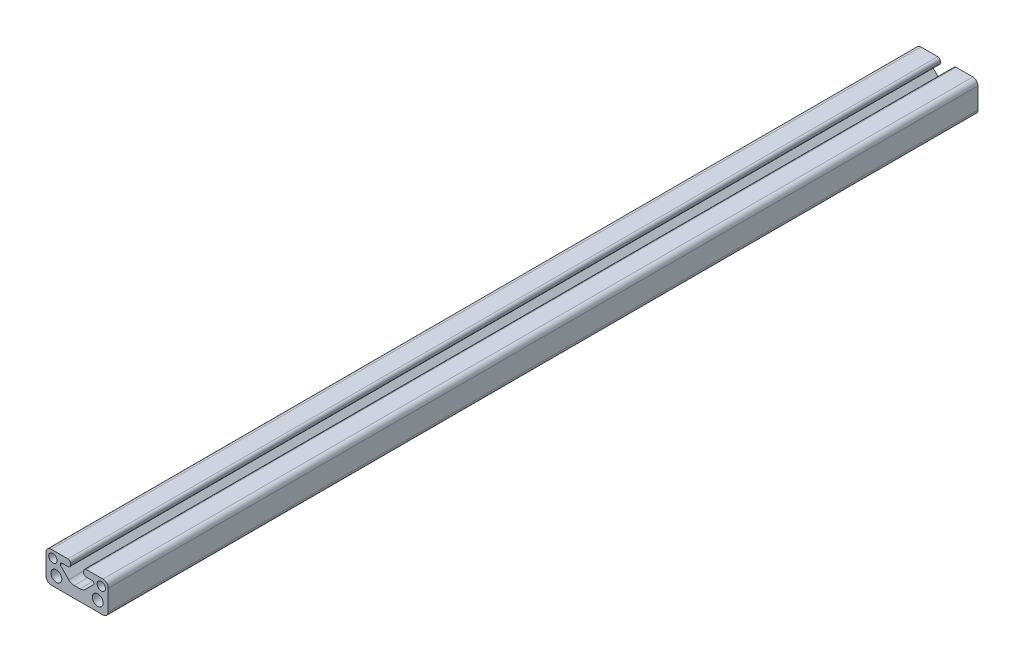
ISO-10303-21;
HEADER;
FILE_DESCRIPTION(('STEP AP214'),'2;1');
FILE_NAME('part.step','',(''),(''),'','','');
FILE_SCHEMA(('AUTOMOTIVE_DESIGN { 1 0 10303 214 1 1 1 1 }'));
ENDSEC;
DATA;
#1=APPLICATION_CONTEXT('core data for automotive mechanical design processes');
#2=APPLICATION_PROTOCOL_DEFINITION('international standard','automotive_design',2000,#1);
#3=PRODUCT_CONTEXT('',#1,'mechanical');
#4=PRODUCT('Part','Part','',(#3));
#5=PRODUCT_RELATED_PRODUCT_CATEGORY('part','',(#4));
#6=PRODUCT_DEFINITION_FORMATION('','',#4);
#7=PRODUCT_DEFINITION_CONTEXT('part definition',#1,'design');
#8=PRODUCT_DEFINITION('design','',#6,#7);
#9=PRODUCT_DEFINITION_SHAPE('','',#8);
#10=(LENGTH_UNIT() NAMED_UNIT(*) SI_UNIT(.MILLI.,.METRE.));
#11=(NAMED_UNIT(*) PLANE_ANGLE_UNIT() SI_UNIT($,.RADIAN.));
#12=(NAMED_UNIT(*) SI_UNIT($,.STERADIAN.) SOLID_ANGLE_UNIT());
#13=UNCERTAINTY_MEASURE_WITH_UNIT(LENGTH_MEASURE(1.E-05),#10,'distance_accuracy_value','');
#14=(GEOMETRIC_REPRESENTATION_CONTEXT(3) GLOBAL_UNCERTAINTY_ASSIGNED_CONTEXT((#13)) GLOBAL_UNIT_ASSIGNED_CONTEXT((#10,
#11,#12)) REPRESENTATION_CONTEXT('',''));
#15=CARTESIAN_POINT('',(0.,0.,0.));
#16=DIRECTION('',(0.,0.,1.));
#17=DIRECTION('',(1.,0.,0.));
#18=AXIS2_PLACEMENT_3D('',#15,#16,#17);
#19=CARTESIAN_POINT('',(-15.8749999999998,3.17500000000252,0.));
#20=DIRECTION('',(0.,0.,-1.));
#21=DIRECTION('',(-1.,0.,0.));
#22=AXIS2_PLACEMENT_3D('',#19,#20,#21);
#23=CYLINDRICAL_SURFACE('',#22,3.17500000000048);
#24=CARTESIAN_POINT('',(-15.8749999999998,3.17500000000252,-533.4));
#25=DIRECTION('',(0.,0.,-1.));
#26=DIRECTION('',(-1.,0.,0.));
#27=AXIS2_PLACEMENT_3D('',#24,#25,#26);
#28=CIRCLE('',#27,3.17500000000048);
#29=CARTESIAN_POINT('',(-15.8749999999998,2.03526431818979E-12,-533.4));
#30=VERTEX_POINT('',#29);
#31=CARTESIAN_POINT('',(-19.0500000000003,3.17500000000252,-533.4));
#32=VERTEX_POINT('',#31);
#33=EDGE_CURVE('E250',#30,#32,#28,.T.);
#34=ORIENTED_EDGE('',*,*,#33,.F.);
#35=DIRECTION('',(0.,0.,-1.));
#36=VECTOR('',#35,1.);
#37=CARTESIAN_POINT('',(-15.8749999999998,2.03526431818979E-12,0.));
#38=LINE('',#37,#36);
#39=CARTESIAN_POINT('',(-15.8749999999998,2.03526431818979E-12,0.));
#40=VERTEX_POINT('',#39);
#41=EDGE_CURVE('E11',#40,#30,#38,.T.);
#42=ORIENTED_EDGE('',*,*,#41,.F.);
#43=CARTESIAN_POINT('',(-15.8749999999998,3.17500000000252,0.));
#44=DIRECTION('',(0.,0.,-1.));
#45=DIRECTION('',(-1.,0.,0.));
#46=AXIS2_PLACEMENT_3D('',#43,#44,#45);
#47=CIRCLE('',#46,3.17500000000048);
#48=CARTESIAN_POINT('',(-19.0500000000003,3.17500000000252,0.));
#49=VERTEX_POINT('',#48);
#50=EDGE_CURVE('E331',#40,#49,#47,.T.);
#51=ORIENTED_EDGE('',*,*,#50,.T.);
#52=DIRECTION('',(0.,0.,-1.));
#53=VECTOR('',#52,1.);
#54=CARTESIAN_POINT('',(-19.0500000000003,3.17500000000252,0.));
#55=LINE('',#54,#53);
#56=EDGE_CURVE('E36',#49,#32,#55,.T.);
#57=ORIENTED_EDGE('',*,*,#56,.T.);
#58=EDGE_LOOP('',(#34,#42,#51,#57));
#59=FACE_BOUND('',#58,.T.);
#60=ADVANCED_FACE('F33',(#59),#23,.T.);
#61=CARTESIAN_POINT('',(15.8749999999993,2.03526431818979E-12,0.));
#62=DIRECTION('',(0.,-1.,0.));
#63=DIRECTION('',(0.,0.,-1.));
#64=AXIS2_PLACEMENT_3D('',#61,#62,#63);
#65=PLANE('',#64);
#66=DIRECTION('',(-1.,0.,0.));
#67=VECTOR('',#66,1.);
#68=CARTESIAN_POINT('',(15.8749999999993,2.03526431818979E-12,-533.4));
#69=LINE('',#68,#67);
#70=CARTESIAN_POINT('',(15.8749999999993,2.03483063732079E-12,-533.4));
#71=VERTEX_POINT('',#70);
#72=EDGE_CURVE('E329',#71,#30,#69,.T.);
#73=ORIENTED_EDGE('',*,*,#72,.F.);
#74=DIRECTION('',(0.,0.,-1.));
#75=VECTOR('',#74,1.);
#76=CARTESIAN_POINT('',(15.8749999999993,2.03483063732079E-12,0.));
#77=LINE('',#76,#75);
#78=CARTESIAN_POINT('',(15.8749999999993,2.03483063732079E-12,0.));
#79=VERTEX_POINT('',#78);
#80=EDGE_CURVE('E42',#79,#71,#77,.T.);
#81=ORIENTED_EDGE('',*,*,#80,.F.);
#82=DIRECTION('',(-1.,0.,0.));
#83=VECTOR('',#82,1.);
#84=CARTESIAN_POINT('',(15.8749999999993,2.03526431818979E-12,0.));
#85=LINE('',#84,#83);
#86=EDGE_CURVE('E240',#79,#40,#85,.T.);
#87=ORIENTED_EDGE('',*,*,#86,.T.);
#88=ORIENTED_EDGE('',*,*,#41,.T.);
#89=EDGE_LOOP('',(#73,#81,#87,#88));
#90=FACE_BOUND('',#89,.T.);
#91=ADVANCED_FACE('F383',(#90),#65,.T.);
#92=CARTESIAN_POINT('',(15.8749999999993,3.17500000000227,0.));
#93=DIRECTION('',(0.,0.,-1.));
#94=DIRECTION('',(-1.,0.,0.));
#95=AXIS2_PLACEMENT_3D('',#92,#93,#94);
#96=CYLINDRICAL_SURFACE('',#95,3.17500000000024);
#97=CARTESIAN_POINT('',(15.8749999999993,3.17500000000227,-533.4));
#98=DIRECTION('',(0.,0.,-1.));
#99=DIRECTION('',(-1.,0.,0.));
#100=AXIS2_PLACEMENT_3D('',#97,#98,#99);
#101=CIRCLE('',#100,3.17500000000024);
#102=CARTESIAN_POINT('',(19.0499999999995,3.17500000000227,-533.4));
#103=VERTEX_POINT('',#102);
#104=EDGE_CURVE('E227',#103,#71,#101,.T.);
#105=ORIENTED_EDGE('',*,*,#104,.F.);
#106=DIRECTION('',(0.,0.,-1.));
#107=VECTOR('',#106,1.);
#108=CARTESIAN_POINT('',(19.0499999999995,3.17500000000227,0.));
#109=LINE('',#108,#107);
#110=CARTESIAN_POINT('',(19.0499999999995,3.17500000000227,0.));
#111=VERTEX_POINT('',#110);
#112=EDGE_CURVE('E222',#111,#103,#109,.T.);
#113=ORIENTED_EDGE('',*,*,#112,.F.);
#114=CARTESIAN_POINT('',(15.8749999999993,3.17500000000227,0.));
#115=DIRECTION('',(0.,0.,-1.));
#116=DIRECTION('',(-1.,0.,0.));
#117=AXIS2_PLACEMENT_3D('',#114,#115,#116);
#118=CIRCLE('',#117,3.17500000000024);
#119=EDGE_CURVE('E225',#111,#79,#118,.T.);
#120=ORIENTED_EDGE('',*,*,#119,.T.);
#121=ORIENTED_EDGE('',*,*,#80,.T.);
#122=EDGE_LOOP('',(#105,#113,#120,#121));
#123=FACE_BOUND('',#122,.T.);
#124=ADVANCED_FACE('F224',(#123),#96,.T.);
#125=CARTESIAN_POINT('',(19.0499999999995,15.8750000000008,0.));
#126=DIRECTION('',(1.,0.,0.));
#127=DIRECTION('',(0.,1.,0.));
#128=AXIS2_PLACEMENT_3D('',#125,#126,#127);
#129=PLANE('',#128);
#130=DIRECTION('',(0.,-1.,0.));
#131=VECTOR('',#130,1.);
#132=CARTESIAN_POINT('',(19.0499999999995,15.8750000000008,-533.4));
#133=LINE('',#132,#131);
#134=CARTESIAN_POINT('',(19.0499999999995,15.8750000000008,-533.4));
#135=VERTEX_POINT('',#134);
#136=EDGE_CURVE('E326',#135,#103,#133,.T.);
#137=ORIENTED_EDGE('',*,*,#136,.F.);
#138=DIRECTION('',(0.,0.,-1.));
#139=VECTOR('',#138,1.);
#140=CARTESIAN_POINT('',(19.0499999999995,15.8750000000008,0.));
#141=LINE('',#140,#139);
#142=CARTESIAN_POINT('',(19.0499999999995,15.8750000000008,0.));
#143=VERTEX_POINT('',#142);
#144=EDGE_CURVE('E232',#143,#135,#141,.T.);
#145=ORIENTED_EDGE('',*,*,#144,.F.);
#146=DIRECTION('',(0.,-1.,0.));
#147=VECTOR('',#146,1.);
#148=CARTESIAN_POINT('',(19.0499999999995,15.8750000000008,0.));
#149=LINE('',#148,#147);
#150=EDGE_CURVE('E238',#143,#111,#149,.T.);
#151=ORIENTED_EDGE('',*,*,#150,.T.);
#152=ORIENTED_EDGE('',*,*,#112,.T.);
#153=EDGE_LOOP('',(#137,#145,#151,#152));
#154=FACE_BOUND('',#153,.T.);
#155=ADVANCED_FACE('F242',(#154),#129,.T.);
#156=CARTESIAN_POINT('',(15.874999999999,15.8750000000008,0.));
#157=DIRECTION('',(0.,0.,-1.));
#158=DIRECTION('',(-1.,0.,0.));
#159=AXIS2_PLACEMENT_3D('',#156,#157,#158);
#160=CYLINDRICAL_SURFACE('',#159,3.17500000000049);
#161=CARTESIAN_POINT('',(15.874999999999,15.8750000000008,-533.4));
#162=DIRECTION('',(0.,0.,-1.));
#163=DIRECTION('',(-1.,0.,0.));
#164=AXIS2_PLACEMENT_3D('',#161,#162,#163);
#165=CIRCLE('',#164,3.17500000000049);
#166=CARTESIAN_POINT('',(15.874999999999,19.0500000000013,-533.4));
#167=VERTEX_POINT('',#166);
#168=EDGE_CURVE('E323',#167,#135,#165,.T.);
#169=ORIENTED_EDGE('',*,*,#168,.F.);
#170=DIRECTION('',(0.,0.,-1.));
#171=VECTOR('',#170,1.);
#172=CARTESIAN_POINT('',(15.874999999999,19.0500000000013,0.));
#173=LINE('',#172,#171);
#174=CARTESIAN_POINT('',(15.874999999999,19.0500000000013,0.));
#175=VERTEX_POINT('',#174);
#176=EDGE_CURVE('E335',#175,#167,#173,.T.);
#177=ORIENTED_EDGE('',*,*,#176,.F.);
#178=CARTESIAN_POINT('',(15.874999999999,15.8750000000008,0.));
#179=DIRECTION('',(0.,0.,-1.));
#180=DIRECTION('',(-1.,0.,0.));
#181=AXIS2_PLACEMENT_3D('',#178,#179,#180);
#182=CIRCLE('',#181,3.17500000000049);
#183=EDGE_CURVE('E243',#175,#143,#182,.T.);
#184=ORIENTED_EDGE('',*,*,#183,.T.);
#185=ORIENTED_EDGE('',*,*,#144,.T.);
#186=EDGE_LOOP('',(#169,#177,#184,#185));
#187=FACE_BOUND('',#186,.T.);
#188=ADVANCED_FACE('F396',(#187),#160,.T.);
#189=CARTESIAN_POINT('',(5.63879999999924,19.0500000000013,0.));
#190=DIRECTION('',(0.,1.,0.));
#191=DIRECTION('',(-1.,0.,0.));
#192=AXIS2_PLACEMENT_3D('',#189,#190,#191);
#193=PLANE('',#192);
#194=DIRECTION('',(1.,0.,0.));
#195=VECTOR('',#194,1.);
#196=CARTESIAN_POINT('',(5.63879999999924,19.0500000000013,-533.4));
#197=LINE('',#196,#195);
#198=CARTESIAN_POINT('',(5.63879999999924,19.0500000000013,-533.4));
#199=VERTEX_POINT('',#198);
#200=EDGE_CURVE('E320',#199,#167,#197,.T.);
#201=ORIENTED_EDGE('',*,*,#200,.F.);
#202=DIRECTION('',(0.,0.,-1.));
#203=VECTOR('',#202,1.);
#204=CARTESIAN_POINT('',(5.63879999999924,19.0500000000013,0.));
#205=LINE('',#204,#203);
#206=CARTESIAN_POINT('',(5.63879999999924,19.0500000000013,0.));
#207=VERTEX_POINT('',#206);
#208=EDGE_CURVE('E337',#207,#199,#205,.T.);
#209=ORIENTED_EDGE('',*,*,#208,.F.);
#210=DIRECTION('',(1.,0.,0.));
#211=VECTOR('',#210,1.);
#212=CARTESIAN_POINT('',(5.63879999999924,19.0500000000013,0.));
#213=LINE('',#212,#211);
#214=EDGE_CURVE('E245',#207,#175,#213,.T.);
#215=ORIENTED_EDGE('',*,*,#214,.T.);
#216=ORIENTED_EDGE('',*,*,#176,.T.);
#217=EDGE_LOOP('',(#201,#209,#215,#216));
#218=FACE_BOUND('',#217,.T.);
#219=ADVANCED_FACE('F399',(#218),#193,.T.);
#220=CARTESIAN_POINT('',(5.63879999999924,17.4752000000017,0.));
#221=DIRECTION('',(0.,0.,-1.));
#222=DIRECTION('',(-1.,0.,0.));
#223=AXIS2_PLACEMENT_3D('',#220,#221,#222);
#224=CYLINDRICAL_SURFACE('',#223,1.57479999999962);
#225=CARTESIAN_POINT('',(5.63879999999924,17.4752000000017,-533.4));
#226=DIRECTION('',(0.,0.,-1.));
#227=DIRECTION('',(-1.,0.,0.));
#228=AXIS2_PLACEMENT_3D('',#225,#226,#227);
#229=CIRCLE('',#228,1.57479999999962);
#230=CARTESIAN_POINT('',(4.06399999999962,17.4752000000017,-533.4));
#231=VERTEX_POINT('',#230);
#232=EDGE_CURVE('E317',#231,#199,#229,.T.);
#233=ORIENTED_EDGE('',*,*,#232,.F.);
#234=DIRECTION('',(0.,0.,-1.));
#235=VECTOR('',#234,1.);
#236=CARTESIAN_POINT('',(4.06399999999962,17.4752000000017,0.));
#237=LINE('',#236,#235);
#238=CARTESIAN_POINT('',(4.06399999999962,17.4752000000017,0.));
#239=VERTEX_POINT('',#238);
#240=EDGE_CURVE('E339',#239,#231,#237,.T.);
#241=ORIENTED_EDGE('',*,*,#240,.F.);
#242=CARTESIAN_POINT('',(5.63879999999924,17.4752000000017,0.));
#243=DIRECTION('',(0.,0.,-1.));
#244=DIRECTION('',(-1.,0.,0.));
#245=AXIS2_PLACEMENT_3D('',#242,#243,#244);
#246=CIRCLE('',#245,1.57479999999962);
#247=EDGE_CURVE('E605',#239,#207,#246,.T.);
#248=ORIENTED_EDGE('',*,*,#247,.T.);
#249=ORIENTED_EDGE('',*,*,#208,.T.);
#250=EDGE_LOOP('',(#233,#241,#248,#249));
#251=FACE_BOUND('',#250,.T.);
#252=ADVANCED_FACE('F403',(#251),#224,.T.);
#253=CARTESIAN_POINT('',(4.06399999999924,16.5608,0.));
#254=DIRECTION('',(-1.,4.15468549035679E-13,0.));
#255=DIRECTION('',(-4.15468549035679E-13,-1.,0.));
#256=AXIS2_PLACEMENT_3D('',#253,#254,#255);
#257=PLANE('',#256);
#258=DIRECTION('',(4.15468549035679E-13,1.,0.));
#259=VECTOR('',#258,1.);
#260=CARTESIAN_POINT('',(4.06399999999924,16.5608,-533.4));
#261=LINE('',#260,#259);
#262=CARTESIAN_POINT('',(4.06399999999943,16.5608000000002,-533.4));
#263=VERTEX_POINT('',#262);
#264=EDGE_CURVE('E314',#263,#231,#261,.T.);
#265=ORIENTED_EDGE('',*,*,#264,.F.);
#266=DIRECTION('',(0.,0.,-1.));
#267=VECTOR('',#266,1.);
#268=CARTESIAN_POINT('',(4.06399999999943,16.5608000000002,0.));
#269=LINE('',#268,#267);
#270=CARTESIAN_POINT('',(4.06399999999943,16.5608000000002,0.));
#271=VERTEX_POINT('',#270);
#272=EDGE_CURVE('E341',#271,#263,#269,.T.);
#273=ORIENTED_EDGE('',*,*,#272,.F.);
#274=DIRECTION('',(4.15468549035679E-13,1.,0.));
#275=VECTOR('',#274,1.);
#276=CARTESIAN_POINT('',(4.06399999999924,16.5608,0.));
#277=LINE('',#276,#275);
#278=EDGE_CURVE('E602',#271,#239,#277,.T.);
#279=ORIENTED_EDGE('',*,*,#278,.T.);
#280=ORIENTED_EDGE('',*,*,#240,.T.);
#281=EDGE_LOOP('',(#265,#273,#279,#280));
#282=FACE_BOUND('',#281,.T.);
#283=ADVANCED_FACE('F407',(#282),#257,.T.);
#284=CARTESIAN_POINT('',(5.63879999999924,16.5608000000002,0.));
#285=DIRECTION('',(0.,0.,-1.));
#286=DIRECTION('',(-1.,0.,0.));
#287=AXIS2_PLACEMENT_3D('',#284,#285,#286);
#288=CYLINDRICAL_SURFACE('',#287,1.57479999999981);
#289=CARTESIAN_POINT('',(5.63879999999924,16.5608000000002,-533.4));
#290=DIRECTION('',(0.,0.,-1.));
#291=DIRECTION('',(-1.,0.,0.));
#292=AXIS2_PLACEMENT_3D('',#289,#290,#291);
#293=CIRCLE('',#292,1.57479999999981);
#294=CARTESIAN_POINT('',(5.63879999999924,14.9860000000005,-533.4));
#295=VERTEX_POINT('',#294);
#296=EDGE_CURVE('E311',#295,#263,#293,.T.);
#297=ORIENTED_EDGE('',*,*,#296,.F.);
#298=DIRECTION('',(0.,0.,-1.));
#299=VECTOR('',#298,1.);
#300=CARTESIAN_POINT('',(5.63879999999924,14.9860000000005,0.));
#301=LINE('',#300,#299);
#302=CARTESIAN_POINT('',(5.63879999999924,14.9860000000005,0.));
#303=VERTEX_POINT('',#302);
#304=EDGE_CURVE('E343',#303,#295,#301,.T.);
#305=ORIENTED_EDGE('',*,*,#304,.F.);
#306=CARTESIAN_POINT('',(5.63879999999924,16.5608000000002,0.));
#307=DIRECTION('',(0.,0.,-1.));
#308=DIRECTION('',(-1.,0.,0.));
#309=AXIS2_PLACEMENT_3D('',#306,#307,#308);
#310=CIRCLE('',#309,1.57479999999981);
#311=EDGE_CURVE('E599',#303,#271,#310,.T.);
#312=ORIENTED_EDGE('',*,*,#311,.T.);
#313=ORIENTED_EDGE('',*,*,#272,.T.);
#314=EDGE_LOOP('',(#297,#305,#312,#313));
#315=FACE_BOUND('',#314,.T.);
#316=ADVANCED_FACE('F411',(#315),#288,.T.);
#317=CARTESIAN_POINT('',(9.39800000000053,14.9860000000005,0.));
#318=DIRECTION('',(0.,-1.,0.));
#319=DIRECTION('',(0.,0.,-1.));
#320=AXIS2_PLACEMENT_3D('',#317,#318,#319);
#321=PLANE('',#320);
#322=DIRECTION('',(-1.,0.,0.));
#323=VECTOR('',#322,1.);
#324=CARTESIAN_POINT('',(9.39800000000053,14.9860000000005,-533.4));
#325=LINE('',#324,#323);
#326=CARTESIAN_POINT('',(9.39800000000053,14.9860000000004,-533.4));
#327=VERTEX_POINT('',#326);
#328=EDGE_CURVE('E308',#327,#295,#325,.T.);
#329=ORIENTED_EDGE('',*,*,#328,.F.);
#330=DIRECTION('',(0.,0.,-1.));
#331=VECTOR('',#330,1.);
#332=CARTESIAN_POINT('',(9.39800000000053,14.9860000000004,0.));
#333=LINE('',#332,#331);
#334=CARTESIAN_POINT('',(9.39800000000053,14.9860000000004,0.));
#335=VERTEX_POINT('',#334);
#336=EDGE_CURVE('E345',#335,#327,#333,.T.);
#337=ORIENTED_EDGE('',*,*,#336,.F.);
#338=DIRECTION('',(-1.,0.,0.));
#339=VECTOR('',#338,1.);
#340=CARTESIAN_POINT('',(9.39800000000053,14.9860000000005,0.));
#341=LINE('',#340,#339);
#342=EDGE_CURVE('E596',#335,#303,#341,.T.);
#343=ORIENTED_EDGE('',*,*,#342,.T.);
#344=ORIENTED_EDGE('',*,*,#304,.T.);
#345=EDGE_LOOP('',(#329,#337,#343,#344));
#346=FACE_BOUND('',#345,.T.);
#347=ADVANCED_FACE('F415',(#346),#321,.T.);
#348=CARTESIAN_POINT('',(9.39800000000053,14.0970000000005,0.));
#349=DIRECTION('',(0.,0.,-1.));
#350=DIRECTION('',(-1.,0.,0.));
#351=AXIS2_PLACEMENT_3D('',#348,#349,#350);
#352=CYLINDRICAL_SURFACE('',#351,0.888999999999866);
#353=CARTESIAN_POINT('',(9.39800000000053,14.0970000000005,-533.4));
#354=DIRECTION('',(0.,0.,1.));
#355=DIRECTION('',(1.,0.,0.));
#356=AXIS2_PLACEMENT_3D('',#353,#354,#355);
#357=CIRCLE('',#356,0.888999999999866);
#358=CARTESIAN_POINT('',(10.2870000000003,14.0970000000008,-533.4));
#359=VERTEX_POINT('',#358);
#360=EDGE_CURVE('E305',#359,#327,#357,.T.);
#361=ORIENTED_EDGE('',*,*,#360,.F.);
#362=DIRECTION('',(0.,0.,-1.));
#363=VECTOR('',#362,1.);
#364=CARTESIAN_POINT('',(10.2870000000003,14.0970000000008,0.));
#365=LINE('',#364,#363);
#366=CARTESIAN_POINT('',(10.2870000000003,14.0970000000008,0.));
#367=VERTEX_POINT('',#366);
#368=EDGE_CURVE('E347',#367,#359,#365,.T.);
#369=ORIENTED_EDGE('',*,*,#368,.F.);
#370=CARTESIAN_POINT('',(9.39800000000053,14.0970000000005,0.));
#371=DIRECTION('',(0.,0.,1.));
#372=DIRECTION('',(1.,0.,0.));
#373=AXIS2_PLACEMENT_3D('',#370,#371,#372);
#374=CIRCLE('',#373,0.888999999999866);
#375=EDGE_CURVE('E593',#367,#335,#374,.T.);
#376=ORIENTED_EDGE('',*,*,#375,.T.);
#377=ORIENTED_EDGE('',*,*,#336,.T.);
#378=EDGE_LOOP('',(#361,#369,#376,#377));
#379=FACE_BOUND('',#378,.T.);
#380=ADVANCED_FACE('F419',(#379),#352,.F.);
#381=CARTESIAN_POINT('',(10.2870000000003,13.7794358569473,0.));
#382=DIRECTION('',(-1.,0.,0.));
#383=DIRECTION('',(0.,0.,1.));
#384=AXIS2_PLACEMENT_3D('',#381,#382,#383);
#385=PLANE('',#384);
#386=DIRECTION('',(0.,1.,0.));
#387=VECTOR('',#386,1.);
#388=CARTESIAN_POINT('',(10.2870000000003,13.7794358569473,-533.4));
#389=LINE('',#388,#387);
#390=CARTESIAN_POINT('',(10.2870000000003,13.7794358569473,-533.4));
#391=VERTEX_POINT('',#390);
#392=EDGE_CURVE('E302',#391,#359,#389,.T.);
#393=ORIENTED_EDGE('',*,*,#392,.F.);
#394=DIRECTION('',(0.,0.,-1.));
#395=VECTOR('',#394,1.);
#396=CARTESIAN_POINT('',(10.2870000000003,13.7794358569473,0.));
#397=LINE('',#396,#395);
#398=CARTESIAN_POINT('',(10.2870000000003,13.7794358569473,0.));
#399=VERTEX_POINT('',#398);
#400=EDGE_CURVE('E349',#399,#391,#397,.T.);
#401=ORIENTED_EDGE('',*,*,#400,.F.);
#402=DIRECTION('',(0.,1.,0.));
#403=VECTOR('',#402,1.);
#404=CARTESIAN_POINT('',(10.2870000000003,13.7794358569473,0.));
#405=LINE('',#404,#403);
#406=EDGE_CURVE('E590',#399,#367,#405,.T.);
#407=ORIENTED_EDGE('',*,*,#406,.T.);
#408=ORIENTED_EDGE('',*,*,#368,.T.);
#409=EDGE_LOOP('',(#393,#401,#407,#408));
#410=FACE_BOUND('',#409,.T.);
#411=ADVANCED_FACE('F423',(#410),#385,.T.);
#412=CARTESIAN_POINT('',(9.39800000000315,13.7794358569473,0.));
#413=DIRECTION('',(0.,0.,-1.));
#414=DIRECTION('',(-1.,0.,0.));
#415=AXIS2_PLACEMENT_3D('',#412,#413,#414);
#416=CYLINDRICAL_SURFACE('',#415,0.888999999997112);
#417=CARTESIAN_POINT('',(9.39800000000315,13.7794358569473,-533.4));
#418=DIRECTION('',(0.,0.,1.));
#419=DIRECTION('',(1.,0.,0.));
#420=AXIS2_PLACEMENT_3D('',#417,#418,#419);
#421=CIRCLE('',#420,0.888999999997112);
#422=CARTESIAN_POINT('',(10.026617928476,13.1508179284745,-533.4));
#423=VERTEX_POINT('',#422);
#424=EDGE_CURVE('E299',#423,#391,#421,.T.);
#425=ORIENTED_EDGE('',*,*,#424,.F.);
#426=DIRECTION('',(0.,0.,-1.));
#427=VECTOR('',#426,1.);
#428=CARTESIAN_POINT('',(10.026617928476,13.1508179284745,0.));
#429=LINE('',#428,#427);
#430=CARTESIAN_POINT('',(10.026617928476,13.1508179284745,0.));
#431=VERTEX_POINT('',#430);
#432=EDGE_CURVE('E351',#431,#423,#429,.T.);
#433=ORIENTED_EDGE('',*,*,#432,.F.);
#434=CARTESIAN_POINT('',(9.39800000000315,13.7794358569473,0.));
#435=DIRECTION('',(0.,0.,1.));
#436=DIRECTION('',(1.,0.,0.));
#437=AXIS2_PLACEMENT_3D('',#434,#435,#436);
#438=CIRCLE('',#437,0.888999999997112);
#439=EDGE_CURVE('E587',#431,#399,#438,.T.);
#440=ORIENTED_EDGE('',*,*,#439,.T.);
#441=ORIENTED_EDGE('',*,*,#400,.T.);
#442=EDGE_LOOP('',(#425,#433,#440,#441));
#443=FACE_BOUND('',#442,.T.);
#444=ADVANCED_FACE('F427',(#443),#416,.F.);
#445=CARTESIAN_POINT('',(5.12498421071956,8.2491842107181,0.));
#446=DIRECTION('',(-0.707106781186548,0.707106781186547,0.));
#447=DIRECTION('',(-0.707106781186547,-0.707106781186548,0.));
#448=AXIS2_PLACEMENT_3D('',#445,#446,#447);
#449=PLANE('',#448);
#450=DIRECTION('',(0.707106781186547,0.707106781186548,0.));
#451=VECTOR('',#450,1.);
#452=CARTESIAN_POINT('',(5.12498421071956,8.2491842107181,-533.4));
#453=LINE('',#452,#451);
#454=CARTESIAN_POINT('',(5.12498421071956,8.2491842107181,-533.4));
#455=VERTEX_POINT('',#454);
#456=EDGE_CURVE('E296',#455,#423,#453,.T.);
#457=ORIENTED_EDGE('',*,*,#456,.F.);
#458=DIRECTION('',(0.,0.,-1.));
#459=VECTOR('',#458,1.);
#460=CARTESIAN_POINT('',(5.12498421071956,8.2491842107181,0.));
#461=LINE('',#460,#459);
#462=CARTESIAN_POINT('',(5.12498421071956,8.2491842107181,0.));
#463=VERTEX_POINT('',#462);
#464=EDGE_CURVE('E353',#463,#455,#461,.T.);
#465=ORIENTED_EDGE('',*,*,#464,.F.);
#466=DIRECTION('',(0.707106781186547,0.707106781186548,0.));
#467=VECTOR('',#466,1.);
#468=CARTESIAN_POINT('',(5.12498421071956,8.2491842107181,0.));
#469=LINE('',#468,#467);
#470=EDGE_CURVE('E584',#463,#431,#469,.T.);
#471=ORIENTED_EDGE('',*,*,#470,.T.);
#472=ORIENTED_EDGE('',*,*,#432,.T.);
#473=EDGE_LOOP('',(#457,#465,#471,#472));
#474=FACE_BOUND('',#473,.T.);
#475=ADVANCED_FACE('F431',(#474),#449,.T.);
#476=CARTESIAN_POINT('',(1.7663684214397,11.607799999998,0.));
#477=DIRECTION('',(0.,0.,-1.));
#478=DIRECTION('',(-1.,0.,0.));
#479=AXIS2_PLACEMENT_3D('',#476,#477,#478);
#480=CYLINDRICAL_SURFACE('',#479,4.7498);
#481=CARTESIAN_POINT('',(1.7663684214397,11.607799999998,-533.4));
#482=DIRECTION('',(0.,0.,1.));
#483=DIRECTION('',(1.,0.,0.));
#484=AXIS2_PLACEMENT_3D('',#481,#482,#483);
#485=CIRCLE('',#484,4.7498);
#486=CARTESIAN_POINT('',(1.7663684214397,6.85799999999796,-533.4));
#487=VERTEX_POINT('',#486);
#488=EDGE_CURVE('E293',#487,#455,#485,.T.);
#489=ORIENTED_EDGE('',*,*,#488,.F.);
#490=DIRECTION('',(0.,0.,-1.));
#491=VECTOR('',#490,1.);
#492=CARTESIAN_POINT('',(1.7663684214397,6.85799999999796,0.));
#493=LINE('',#492,#491);
#494=CARTESIAN_POINT('',(1.7663684214397,6.85799999999796,0.));
#495=VERTEX_POINT('',#494);
#496=EDGE_CURVE('E355',#495,#487,#493,.T.);
#497=ORIENTED_EDGE('',*,*,#496,.F.);
#498=CARTESIAN_POINT('',(1.7663684214397,11.607799999998,0.));
#499=DIRECTION('',(0.,0.,1.));
#500=DIRECTION('',(1.,0.,0.));
#501=AXIS2_PLACEMENT_3D('',#498,#499,#500);
#502=CIRCLE('',#501,4.7498);
#503=EDGE_CURVE('E581',#495,#463,#502,.T.);
#504=ORIENTED_EDGE('',*,*,#503,.T.);
#505=ORIENTED_EDGE('',*,*,#464,.T.);
#506=EDGE_LOOP('',(#489,#497,#504,#505));
#507=FACE_BOUND('',#506,.T.);
#508=ADVANCED_FACE('F435',(#507),#480,.F.);
#509=CARTESIAN_POINT('',(-1.76636842144084,6.85799999999796,0.));
#510=DIRECTION('',(0.,1.,0.));
#511=DIRECTION('',(-1.,0.,0.));
#512=AXIS2_PLACEMENT_3D('',#509,#510,#511);
#513=PLANE('',#512);
#514=DIRECTION('',(1.,0.,0.));
#515=VECTOR('',#514,1.);
#516=CARTESIAN_POINT('',(-1.76636842144084,6.85799999999796,-533.4));
#517=LINE('',#516,#515);
#518=CARTESIAN_POINT('',(-1.76636842144084,6.85799999999796,-533.4));
#519=VERTEX_POINT('',#518);
#520=EDGE_CURVE('E290',#519,#487,#517,.T.);
#521=ORIENTED_EDGE('',*,*,#520,.F.);
#522=DIRECTION('',(0.,0.,-1.));
#523=VECTOR('',#522,1.);
#524=CARTESIAN_POINT('',(-1.76636842144084,6.85799999999796,0.));
#525=LINE('',#524,#523);
#526=CARTESIAN_POINT('',(-1.76636842144084,6.85799999999796,0.));
#527=VERTEX_POINT('',#526);
#528=EDGE_CURVE('E357',#527,#519,#525,.T.);
#529=ORIENTED_EDGE('',*,*,#528,.F.);
#530=DIRECTION('',(1.,0.,0.));
#531=VECTOR('',#530,1.);
#532=CARTESIAN_POINT('',(-1.76636842144084,6.85799999999796,0.));
#533=LINE('',#532,#531);
#534=EDGE_CURVE('E578',#527,#495,#533,.T.);
#535=ORIENTED_EDGE('',*,*,#534,.T.);
#536=ORIENTED_EDGE('',*,*,#496,.T.);
#537=EDGE_LOOP('',(#521,#529,#535,#536));
#538=FACE_BOUND('',#537,.T.);
#539=ADVANCED_FACE('F439',(#538),#513,.T.);
#540=CARTESIAN_POINT('',(-1.76636842144084,11.607799999998,0.));
#541=DIRECTION('',(0.,0.,-1.));
#542=DIRECTION('',(-1.,0.,0.));
#543=AXIS2_PLACEMENT_3D('',#540,#541,#542);
#544=CYLINDRICAL_SURFACE('',#543,4.7498);
#545=CARTESIAN_POINT('',(-1.76636842144084,11.607799999998,-533.4));
#546=DIRECTION('',(0.,0.,1.));
#547=DIRECTION('',(1.,0.,0.));
#548=AXIS2_PLACEMENT_3D('',#545,#546,#547);
#549=CIRCLE('',#548,4.7498);
#550=CARTESIAN_POINT('',(-5.12498421072071,8.2491842107181,-533.4));
#551=VERTEX_POINT('',#550);
#552=EDGE_CURVE('E287',#551,#519,#549,.T.);
#553=ORIENTED_EDGE('',*,*,#552,.F.);
#554=DIRECTION('',(0.,0.,-1.));
#555=VECTOR('',#554,1.);
#556=CARTESIAN_POINT('',(-5.12498421072071,8.2491842107181,0.));
#557=LINE('',#556,#555);
#558=CARTESIAN_POINT('',(-5.12498421072071,8.2491842107181,0.));
#559=VERTEX_POINT('',#558);
#560=EDGE_CURVE('E359',#559,#551,#557,.T.);
#561=ORIENTED_EDGE('',*,*,#560,.F.);
#562=CARTESIAN_POINT('',(-1.76636842144084,11.607799999998,0.));
#563=DIRECTION('',(0.,0.,1.));
#564=DIRECTION('',(1.,0.,0.));
#565=AXIS2_PLACEMENT_3D('',#562,#563,#564);
#566=CIRCLE('',#565,4.7498);
#567=EDGE_CURVE('E575',#559,#527,#566,.T.);
#568=ORIENTED_EDGE('',*,*,#567,.T.);
#569=ORIENTED_EDGE('',*,*,#528,.T.);
#570=EDGE_LOOP('',(#553,#561,#568,#569));
#571=FACE_BOUND('',#570,.T.);
#572=ADVANCED_FACE('F443',(#571),#544,.F.);
#573=CARTESIAN_POINT('',(-10.0266179284771,13.1508179284745,0.));
#574=DIRECTION('',(0.707106781186548,0.707106781186548,0.));
#575=DIRECTION('',(-0.707106781186548,0.707106781186548,0.));
#576=AXIS2_PLACEMENT_3D('',#573,#574,#575);
#577=PLANE('',#576);
#578=DIRECTION('',(0.707106781186548,-0.707106781186548,0.));
#579=VECTOR('',#578,1.);
#580=CARTESIAN_POINT('',(-10.0266179284771,13.1508179284745,-533.4));
#581=LINE('',#580,#579);
#582=CARTESIAN_POINT('',(-10.0266179284771,13.1508179284745,-533.4));
#583=VERTEX_POINT('',#582);
#584=EDGE_CURVE('E284',#583,#551,#581,.T.);
#585=ORIENTED_EDGE('',*,*,#584,.F.);
#586=DIRECTION('',(0.,0.,-1.));
#587=VECTOR('',#586,1.);
#588=CARTESIAN_POINT('',(-10.0266179284771,13.1508179284745,0.));
#589=LINE('',#588,#587);
#590=CARTESIAN_POINT('',(-10.0266179284771,13.1508179284745,0.));
#591=VERTEX_POINT('',#590);
#592=EDGE_CURVE('E361',#591,#583,#589,.T.);
#593=ORIENTED_EDGE('',*,*,#592,.F.);
#594=DIRECTION('',(0.707106781186548,-0.707106781186548,0.));
#595=VECTOR('',#594,1.);
#596=CARTESIAN_POINT('',(-10.0266179284771,13.1508179284745,0.));
#597=LINE('',#596,#595);
#598=EDGE_CURVE('E572',#591,#559,#597,.T.);
#599=ORIENTED_EDGE('',*,*,#598,.T.);
#600=ORIENTED_EDGE('',*,*,#560,.T.);
#601=EDGE_LOOP('',(#585,#593,#599,#600));
#602=FACE_BOUND('',#601,.T.);
#603=ADVANCED_FACE('F447',(#602),#577,.T.);
#604=CARTESIAN_POINT('',(-9.39800000000429,13.7794358569473,0.));
#605=DIRECTION('',(0.,0.,-1.));
#606=DIRECTION('',(-1.,0.,0.));
#607=AXIS2_PLACEMENT_3D('',#604,#605,#606);
#608=CYLINDRICAL_SURFACE('',#607,0.888999999997118);
#609=CARTESIAN_POINT('',(-9.39800000000429,13.7794358569473,-533.4));
#610=DIRECTION('',(0.,0.,1.));
#611=DIRECTION('',(1.,0.,0.));
#612=AXIS2_PLACEMENT_3D('',#609,#610,#611);
#613=CIRCLE('',#612,0.888999999997118);
#614=CARTESIAN_POINT('',(-10.2870000000014,13.7794358569473,-533.4));
#615=VERTEX_POINT('',#614);
#616=EDGE_CURVE('E281',#615,#583,#613,.T.);
#617=ORIENTED_EDGE('',*,*,#616,.F.);
#618=DIRECTION('',(0.,0.,-1.));
#619=VECTOR('',#618,1.);
#620=CARTESIAN_POINT('',(-10.2870000000014,13.7794358569473,0.));
#621=LINE('',#620,#619);
#622=CARTESIAN_POINT('',(-10.2870000000014,13.7794358569473,0.));
#623=VERTEX_POINT('',#622);
#624=EDGE_CURVE('E363',#623,#615,#621,.T.);
#625=ORIENTED_EDGE('',*,*,#624,.F.);
#626=CARTESIAN_POINT('',(-9.39800000000429,13.7794358569473,0.));
#627=DIRECTION('',(0.,0.,1.));
#628=DIRECTION('',(1.,0.,0.));
#629=AXIS2_PLACEMENT_3D('',#626,#627,#628);
#630=CIRCLE('',#629,0.888999999997118);
#631=EDGE_CURVE('E569',#623,#591,#630,.T.);
#632=ORIENTED_EDGE('',*,*,#631,.T.);
#633=ORIENTED_EDGE('',*,*,#592,.T.);
#634=EDGE_LOOP('',(#617,#625,#632,#633));
#635=FACE_BOUND('',#634,.T.);
#636=ADVANCED_FACE('F451',(#635),#608,.F.);
#637=CARTESIAN_POINT('',(-10.2870000000014,14.0970000000008,0.));
#638=DIRECTION('',(1.,0.,0.));
#639=DIRECTION('',(0.,0.,-1.));
#640=AXIS2_PLACEMENT_3D('',#637,#638,#639);
#641=PLANE('',#640);
#642=DIRECTION('',(0.,-1.,0.));
#643=VECTOR('',#642,1.);
#644=CARTESIAN_POINT('',(-10.2870000000014,14.0970000000008,-533.4));
#645=LINE('',#644,#643);
#646=CARTESIAN_POINT('',(-10.2870000000014,14.0970000000008,-533.4));
#647=VERTEX_POINT('',#646);
#648=EDGE_CURVE('E278',#647,#615,#645,.T.);
#649=ORIENTED_EDGE('',*,*,#648,.F.);
#650=DIRECTION('',(0.,0.,-1.));
#651=VECTOR('',#650,1.);
#652=CARTESIAN_POINT('',(-10.2870000000014,14.0970000000008,0.));
#653=LINE('',#652,#651);
#654=CARTESIAN_POINT('',(-10.2870000000014,14.0970000000008,0.));
#655=VERTEX_POINT('',#654);
#656=EDGE_CURVE('E365',#655,#647,#653,.T.);
#657=ORIENTED_EDGE('',*,*,#656,.F.);
#658=DIRECTION('',(0.,-1.,0.));
#659=VECTOR('',#658,1.);
#660=CARTESIAN_POINT('',(-10.2870000000014,14.0970000000008,0.));
#661=LINE('',#660,#659);
#662=EDGE_CURVE('E566',#655,#623,#661,.T.);
#663=ORIENTED_EDGE('',*,*,#662,.T.);
#664=ORIENTED_EDGE('',*,*,#624,.T.);
#665=EDGE_LOOP('',(#649,#657,#663,#664));
#666=FACE_BOUND('',#665,.T.);
#667=ADVANCED_FACE('F455',(#666),#641,.T.);
#668=CARTESIAN_POINT('',(-9.39800000000168,14.0970000000008,0.));
#669=DIRECTION('',(0.,0.,-1.));
#670=DIRECTION('',(-1.,0.,0.));
#671=AXIS2_PLACEMENT_3D('',#668,#669,#670);
#672=CYLINDRICAL_SURFACE('',#671,0.888999999999732);
#673=CARTESIAN_POINT('',(-9.39800000000168,14.0970000000008,-533.4));
#674=DIRECTION('',(0.,0.,1.));
#675=DIRECTION('',(1.,0.,0.));
#676=AXIS2_PLACEMENT_3D('',#673,#674,#675);
#677=CIRCLE('',#676,0.888999999999732);
#678=CARTESIAN_POINT('',(-9.39800000000168,14.9860000000005,-533.4));
#679=VERTEX_POINT('',#678);
#680=EDGE_CURVE('E275',#679,#647,#677,.T.);
#681=ORIENTED_EDGE('',*,*,#680,.F.);
#682=DIRECTION('',(0.,0.,-1.));
#683=VECTOR('',#682,1.);
#684=CARTESIAN_POINT('',(-9.39800000000168,14.9860000000005,0.));
#685=LINE('',#684,#683);
#686=CARTESIAN_POINT('',(-9.39800000000168,14.9860000000005,0.));
#687=VERTEX_POINT('',#686);
#688=EDGE_CURVE('E367',#687,#679,#685,.T.);
#689=ORIENTED_EDGE('',*,*,#688,.F.);
#690=CARTESIAN_POINT('',(-9.39800000000168,14.0970000000008,0.));
#691=DIRECTION('',(0.,0.,1.));
#692=DIRECTION('',(1.,0.,0.));
#693=AXIS2_PLACEMENT_3D('',#690,#691,#692);
#694=CIRCLE('',#693,0.888999999999732);
#695=EDGE_CURVE('E563',#687,#655,#694,.T.);
#696=ORIENTED_EDGE('',*,*,#695,.T.);
#697=ORIENTED_EDGE('',*,*,#656,.T.);
#698=EDGE_LOOP('',(#681,#689,#696,#697));
#699=FACE_BOUND('',#698,.T.);
#700=ADVANCED_FACE('F459',(#699),#672,.F.);
#701=CARTESIAN_POINT('',(-5.63879999999924,14.9860000000005,0.));
#702=DIRECTION('',(0.,-1.,0.));
#703=DIRECTION('',(0.,0.,-1.));
#704=AXIS2_PLACEMENT_3D('',#701,#702,#703);
#705=PLANE('',#704);
#706=DIRECTION('',(-1.,0.,0.));
#707=VECTOR('',#706,1.);
#708=CARTESIAN_POINT('',(-5.63879999999924,14.9860000000005,-533.4));
#709=LINE('',#708,#707);
#710=CARTESIAN_POINT('',(-5.63879999999924,14.9860000000007,-533.4));
#711=VERTEX_POINT('',#710);
#712=EDGE_CURVE('E272',#711,#679,#709,.T.);
#713=ORIENTED_EDGE('',*,*,#712,.F.);
#714=DIRECTION('',(0.,0.,-1.));
#715=VECTOR('',#714,1.);
#716=CARTESIAN_POINT('',(-5.63879999999924,14.9860000000007,0.));
#717=LINE('',#716,#715);
#718=CARTESIAN_POINT('',(-5.63879999999924,14.9860000000007,0.));
#719=VERTEX_POINT('',#718);
#720=EDGE_CURVE('E369',#719,#711,#717,.T.);
#721=ORIENTED_EDGE('',*,*,#720,.F.);
#722=DIRECTION('',(-1.,0.,0.));
#723=VECTOR('',#722,1.);
#724=CARTESIAN_POINT('',(-5.63879999999924,14.9860000000005,0.));
#725=LINE('',#724,#723);
#726=EDGE_CURVE('E560',#719,#687,#725,.T.);
#727=ORIENTED_EDGE('',*,*,#726,.T.);
#728=ORIENTED_EDGE('',*,*,#688,.T.);
#729=EDGE_LOOP('',(#713,#721,#727,#728));
#730=FACE_BOUND('',#729,.T.);
#731=ADVANCED_FACE('F463',(#730),#705,.T.);
#732=CARTESIAN_POINT('',(-5.63879999999924,16.5608000000002,0.));
#733=DIRECTION('',(0.,0.,-1.));
#734=DIRECTION('',(-1.,0.,0.));
#735=AXIS2_PLACEMENT_3D('',#732,#733,#734);
#736=CYLINDRICAL_SURFACE('',#735,1.57479999999943);
#737=CARTESIAN_POINT('',(-5.63879999999924,16.5608000000002,-533.4));
#738=DIRECTION('',(0.,0.,-1.));
#739=DIRECTION('',(-1.,0.,0.));
#740=AXIS2_PLACEMENT_3D('',#737,#738,#739);
#741=CIRCLE('',#740,1.57479999999943);
#742=CARTESIAN_POINT('',(-4.064,16.5608,-533.4));
#743=VERTEX_POINT('',#742);
#744=EDGE_CURVE('E269',#743,#711,#741,.T.);
#745=ORIENTED_EDGE('',*,*,#744,.F.);
#746=DIRECTION('',(0.,0.,-1.));
#747=VECTOR('',#746,1.);
#748=CARTESIAN_POINT('',(-4.064,16.5608,0.));
#749=LINE('',#748,#747);
#750=CARTESIAN_POINT('',(-4.064,16.5608,0.));
#751=VERTEX_POINT('',#750);
#752=EDGE_CURVE('E371',#751,#743,#749,.T.);
#753=ORIENTED_EDGE('',*,*,#752,.F.);
#754=CARTESIAN_POINT('',(-5.63879999999924,16.5608000000002,0.));
#755=DIRECTION('',(0.,0.,-1.));
#756=DIRECTION('',(-1.,0.,0.));
#757=AXIS2_PLACEMENT_3D('',#754,#755,#756);
#758=CIRCLE('',#757,1.57479999999943);
#759=EDGE_CURVE('E557',#751,#719,#758,.T.);
#760=ORIENTED_EDGE('',*,*,#759,.T.);
#761=ORIENTED_EDGE('',*,*,#720,.T.);
#762=EDGE_LOOP('',(#745,#753,#760,#761));
#763=FACE_BOUND('',#762,.T.);
#764=ADVANCED_FACE('F467',(#763),#736,.T.);
#765=CARTESIAN_POINT('',(-4.06399999999962,17.4752000000017,0.));
#766=DIRECTION('',(1.,-4.18314224029072E-13,0.));
#767=DIRECTION('',(4.18314224029072E-13,1.,0.));
#768=AXIS2_PLACEMENT_3D('',#765,#766,#767);
#769=PLANE('',#768);
#770=DIRECTION('',(-4.18314224029072E-13,-1.,0.));
#771=VECTOR('',#770,1.);
#772=CARTESIAN_POINT('',(-4.06399999999962,17.4752000000017,-533.4));
#773=LINE('',#772,#771);
#774=CARTESIAN_POINT('',(-4.06399999999962,17.4752000000017,-533.4));
#775=VERTEX_POINT('',#774);
#776=EDGE_CURVE('E266',#775,#743,#773,.T.);
#777=ORIENTED_EDGE('',*,*,#776,.F.);
#778=DIRECTION('',(0.,0.,-1.));
#779=VECTOR('',#778,1.);
#780=CARTESIAN_POINT('',(-4.06399999999962,17.4752000000017,0.));
#781=LINE('',#780,#779);
#782=CARTESIAN_POINT('',(-4.06399999999962,17.4752000000017,0.));
#783=VERTEX_POINT('',#782);
#784=EDGE_CURVE('E373',#783,#775,#781,.T.);
#785=ORIENTED_EDGE('',*,*,#784,.F.);
#786=DIRECTION('',(-4.18314224029072E-13,-1.,0.));
#787=VECTOR('',#786,1.);
#788=CARTESIAN_POINT('',(-4.06399999999962,17.4752000000017,0.));
#789=LINE('',#788,#787);
#790=EDGE_CURVE('E554',#783,#751,#789,.T.);
#791=ORIENTED_EDGE('',*,*,#790,.T.);
#792=ORIENTED_EDGE('',*,*,#752,.T.);
#793=EDGE_LOOP('',(#777,#785,#791,#792));
#794=FACE_BOUND('',#793,.T.);
#795=ADVANCED_FACE('F471',(#794),#769,.T.);
#796=CARTESIAN_POINT('',(-5.63879999999924,17.4752000000017,0.));
#797=DIRECTION('',(0.,0.,-1.));
#798=DIRECTION('',(-1.,0.,0.));
#799=AXIS2_PLACEMENT_3D('',#796,#797,#798);
#800=CYLINDRICAL_SURFACE('',#799,1.57479999999962);
#801=CARTESIAN_POINT('',(-5.63879999999924,17.4752000000017,-533.4));
#802=DIRECTION('',(0.,0.,-1.));
#803=DIRECTION('',(-1.,0.,0.));
#804=AXIS2_PLACEMENT_3D('',#801,#802,#803);
#805=CIRCLE('',#804,1.57479999999962);
#806=CARTESIAN_POINT('',(-5.63879999999924,19.0500000000013,-533.4));
#807=VERTEX_POINT('',#806);
#808=EDGE_CURVE('E263',#807,#775,#805,.T.);
#809=ORIENTED_EDGE('',*,*,#808,.F.);
#810=DIRECTION('',(0.,0.,-1.));
#811=VECTOR('',#810,1.);
#812=CARTESIAN_POINT('',(-5.63879999999924,19.0500000000013,0.));
#813=LINE('',#812,#811);
#814=CARTESIAN_POINT('',(-5.63879999999924,19.0500000000013,0.));
#815=VERTEX_POINT('',#814);
#816=EDGE_CURVE('E375',#815,#807,#813,.T.);
#817=ORIENTED_EDGE('',*,*,#816,.F.);
#818=CARTESIAN_POINT('',(-5.63879999999924,17.4752000000017,0.));
#819=DIRECTION('',(0.,0.,-1.));
#820=DIRECTION('',(-1.,0.,0.));
#821=AXIS2_PLACEMENT_3D('',#818,#819,#820);
#822=CIRCLE('',#821,1.57479999999962);
#823=EDGE_CURVE('E551',#815,#783,#822,.T.);
#824=ORIENTED_EDGE('',*,*,#823,.T.);
#825=ORIENTED_EDGE('',*,*,#784,.T.);
#826=EDGE_LOOP('',(#809,#817,#824,#825));
#827=FACE_BOUND('',#826,.T.);
#828=ADVANCED_FACE('F475',(#827),#800,.T.);
#829=CARTESIAN_POINT('',(-15.8749999999998,19.0500000000013,0.));
#830=DIRECTION('',(0.,1.,0.));
#831=DIRECTION('',(-1.,0.,0.));
#832=AXIS2_PLACEMENT_3D('',#829,#830,#831);
#833=PLANE('',#832);
#834=DIRECTION('',(1.,0.,0.));
#835=VECTOR('',#834,1.);
#836=CARTESIAN_POINT('',(-15.8749999999998,19.0500000000013,-533.4));
#837=LINE('',#836,#835);
#838=CARTESIAN_POINT('',(-15.8749999999998,19.0500000000013,-533.4));
#839=VERTEX_POINT('',#838);
#840=EDGE_CURVE('E260',#839,#807,#837,.T.);
#841=ORIENTED_EDGE('',*,*,#840,.F.);
#842=DIRECTION('',(0.,0.,-1.));
#843=VECTOR('',#842,1.);
#844=CARTESIAN_POINT('',(-15.8749999999998,19.0500000000013,0.));
#845=LINE('',#844,#843);
#846=CARTESIAN_POINT('',(-15.8749999999998,19.0500000000013,0.));
#847=VERTEX_POINT('',#846);
#848=EDGE_CURVE('E377',#847,#839,#845,.T.);
#849=ORIENTED_EDGE('',*,*,#848,.F.);
#850=DIRECTION('',(1.,0.,0.));
#851=VECTOR('',#850,1.);
#852=CARTESIAN_POINT('',(-15.8749999999998,19.0500000000013,0.));
#853=LINE('',#852,#851);
#854=EDGE_CURVE('E548',#847,#815,#853,.T.);
#855=ORIENTED_EDGE('',*,*,#854,.T.);
#856=ORIENTED_EDGE('',*,*,#816,.T.);
#857=EDGE_LOOP('',(#841,#849,#855,#856));
#858=FACE_BOUND('',#857,.T.);
#859=ADVANCED_FACE('F479',(#858),#833,.T.);
#860=CARTESIAN_POINT('',(-15.8749999999998,15.8750000000008,0.));
#861=DIRECTION('',(0.,0.,-1.));
#862=DIRECTION('',(-1.,0.,0.));
#863=AXIS2_PLACEMENT_3D('',#860,#861,#862);
#864=CYLINDRICAL_SURFACE('',#863,3.17500000000049);
#865=CARTESIAN_POINT('',(-15.8749999999998,15.8750000000008,-533.4));
#866=DIRECTION('',(0.,0.,-1.));
#867=DIRECTION('',(-1.,0.,0.));
#868=AXIS2_PLACEMENT_3D('',#865,#866,#867);
#869=CIRCLE('',#868,3.17500000000049);
#870=CARTESIAN_POINT('',(-19.0500000000003,15.8750000000008,-533.4));
#871=VERTEX_POINT('',#870);
#872=EDGE_CURVE('E257',#871,#839,#869,.T.);
#873=ORIENTED_EDGE('',*,*,#872,.F.);
#874=DIRECTION('',(0.,0.,-1.));
#875=VECTOR('',#874,1.);
#876=CARTESIAN_POINT('',(-19.0500000000003,15.8750000000008,0.));
#877=LINE('',#876,#875);
#878=CARTESIAN_POINT('',(-19.0500000000003,15.8750000000008,0.));
#879=VERTEX_POINT('',#878);
#880=EDGE_CURVE('E378',#879,#871,#877,.T.);
#881=ORIENTED_EDGE('',*,*,#880,.F.);
#882=CARTESIAN_POINT('',(-15.8749999999998,15.8750000000008,0.));
#883=DIRECTION('',(0.,0.,-1.));
#884=DIRECTION('',(-1.,0.,0.));
#885=AXIS2_PLACEMENT_3D('',#882,#883,#884);
#886=CIRCLE('',#885,3.17500000000049);
#887=EDGE_CURVE('E545',#879,#847,#886,.T.);
#888=ORIENTED_EDGE('',*,*,#887,.T.);
#889=ORIENTED_EDGE('',*,*,#848,.T.);
#890=EDGE_LOOP('',(#873,#881,#888,#889));
#891=FACE_BOUND('',#890,.T.);
#892=ADVANCED_FACE('F483',(#891),#864,.T.);
#893=CARTESIAN_POINT('',(-19.0500000000003,3.17500000000252,0.));
#894=DIRECTION('',(-1.,0.,0.));
#895=DIRECTION('',(0.,0.,1.));
#896=AXIS2_PLACEMENT_3D('',#893,#894,#895);
#897=PLANE('',#896);
#898=DIRECTION('',(0.,1.,0.));
#899=VECTOR('',#898,1.);
#900=CARTESIAN_POINT('',(-19.0500000000003,3.17500000000252,-533.4));
#901=LINE('',#900,#899);
#902=EDGE_CURVE('E253',#32,#871,#901,.T.);
#903=ORIENTED_EDGE('',*,*,#902,.F.);
#904=ORIENTED_EDGE('',*,*,#56,.F.);
#905=DIRECTION('',(0.,1.,0.));
#906=VECTOR('',#905,1.);
#907=CARTESIAN_POINT('',(-19.0500000000003,3.17500000000252,0.));
#908=LINE('',#907,#906);
#909=EDGE_CURVE('E543',#49,#879,#908,.T.);
#910=ORIENTED_EDGE('',*,*,#909,.T.);
#911=ORIENTED_EDGE('',*,*,#880,.T.);
#912=EDGE_LOOP('',(#903,#904,#910,#911));
#913=FACE_BOUND('',#912,.T.);
#914=ADVANCED_FACE('F380',(#913),#897,.T.);
#915=CARTESIAN_POINT('',(-15.8749999999998,3.17500000000252,0.));
#916=DIRECTION('',(0.,0.,-1.));
#917=DIRECTION('',(-1.,0.,0.));
#918=AXIS2_PLACEMENT_3D('',#915,#916,#917);
#919=PLANE('',#918);
#920=CARTESIAN_POINT('',(14.848797074,14.801432678,0.));
#921=DIRECTION('',(0.,0.,-1.));
#922=DIRECTION('',(1.,0.,0.));
#923=AXIS2_PLACEMENT_3D('',#920,#921,#922);
#924=CIRCLE('',#923,2.5527);
#925=CARTESIAN_POINT('',(17.401497074,14.801432678,0.));
#926=VERTEX_POINT('',#925);
#927=EDGE_CURVE('E518',#926,#926,#924,.T.);
#928=ORIENTED_EDGE('',*,*,#927,.T.);
#929=EDGE_LOOP('',(#928));
#930=FACE_BOUND('',#929,.T.);
#931=CARTESIAN_POINT('',(12.7,6.35,0.));
#932=DIRECTION('',(0.,0.,-1.));
#933=DIRECTION('',(1.,0.,0.));
#934=AXIS2_PLACEMENT_3D('',#931,#932,#933);
#935=CIRCLE('',#934,3.3274);
#936=CARTESIAN_POINT('',(16.0274,6.35,0.));
#937=VERTEX_POINT('',#936);
#938=EDGE_CURVE('E526',#937,#937,#935,.T.);
#939=ORIENTED_EDGE('',*,*,#938,.T.);
#940=EDGE_LOOP('',(#939));
#941=FACE_BOUND('',#940,.T.);
#942=CARTESIAN_POINT('',(-12.7,6.35,0.));
#943=DIRECTION('',(0.,0.,-1.));
#944=DIRECTION('',(1.,0.,0.));
#945=AXIS2_PLACEMENT_3D('',#942,#943,#944);
#946=CIRCLE('',#945,3.3274);
#947=CARTESIAN_POINT('',(-9.3726,6.35,0.));
#948=VERTEX_POINT('',#947);
#949=EDGE_CURVE('E532',#948,#948,#946,.T.);
#950=ORIENTED_EDGE('',*,*,#949,.T.);
#951=EDGE_LOOP('',(#950));
#952=FACE_BOUND('',#951,.T.);
#953=CARTESIAN_POINT('',(-14.848797074,14.801432678,0.));
#954=DIRECTION('',(0.,0.,-1.));
#955=DIRECTION('',(1.,0.,0.));
#956=AXIS2_PLACEMENT_3D('',#953,#954,#955);
#957=CIRCLE('',#956,2.5527);
#958=CARTESIAN_POINT('',(-12.296097074,14.801432678,0.));
#959=VERTEX_POINT('',#958);
#960=EDGE_CURVE('E254',#959,#959,#957,.T.);
#961=ORIENTED_EDGE('',*,*,#960,.T.);
#962=EDGE_LOOP('',(#961));
#963=FACE_BOUND('',#962,.T.);
#964=ORIENTED_EDGE('',*,*,#50,.F.);
#965=ORIENTED_EDGE('',*,*,#86,.F.);
#966=ORIENTED_EDGE('',*,*,#119,.F.);
#967=ORIENTED_EDGE('',*,*,#150,.F.);
#968=ORIENTED_EDGE('',*,*,#183,.F.);
#969=ORIENTED_EDGE('',*,*,#214,.F.);
#970=ORIENTED_EDGE('',*,*,#247,.F.);
#971=ORIENTED_EDGE('',*,*,#278,.F.);
#972=ORIENTED_EDGE('',*,*,#311,.F.);
#973=ORIENTED_EDGE('',*,*,#342,.F.);
#974=ORIENTED_EDGE('',*,*,#375,.F.);
#975=ORIENTED_EDGE('',*,*,#406,.F.);
#976=ORIENTED_EDGE('',*,*,#439,.F.);
#977=ORIENTED_EDGE('',*,*,#470,.F.);
#978=ORIENTED_EDGE('',*,*,#503,.F.);
#979=ORIENTED_EDGE('',*,*,#534,.F.);
#980=ORIENTED_EDGE('',*,*,#567,.F.);
#981=ORIENTED_EDGE('',*,*,#598,.F.);
#982=ORIENTED_EDGE('',*,*,#631,.F.);
#983=ORIENTED_EDGE('',*,*,#662,.F.);
#984=ORIENTED_EDGE('',*,*,#695,.F.);
#985=ORIENTED_EDGE('',*,*,#726,.F.);
#986=ORIENTED_EDGE('',*,*,#759,.F.);
#987=ORIENTED_EDGE('',*,*,#790,.F.);
#988=ORIENTED_EDGE('',*,*,#823,.F.);
#989=ORIENTED_EDGE('',*,*,#854,.F.);
#990=ORIENTED_EDGE('',*,*,#887,.F.);
#991=ORIENTED_EDGE('',*,*,#909,.F.);
#992=EDGE_LOOP('',(#964,#965,#966,#967,#968,#969,#970,#971,#972,#973,#974,#975,#976,#977,#978,
#979,#980,#981,#982,#983,#984,#985,#986,#987,#988,#989,#990,#991));
#993=FACE_BOUND('',#992,.T.);
#994=ADVANCED_FACE('F236',(#930,#941,#952,#963,#993),#919,.F.);
#995=CARTESIAN_POINT('',(-15.8749999999998,3.17500000000252,-533.4));
#996=DIRECTION('',(0.,0.,-1.));
#997=DIRECTION('',(-1.,0.,0.));
#998=AXIS2_PLACEMENT_3D('',#995,#996,#997);
#999=PLANE('',#998);
#1000=CARTESIAN_POINT('',(14.848797074,14.801432678,-533.4));
#1001=DIRECTION('',(0.,0.,-1.));
#1002=DIRECTION('',(1.,0.,0.));
#1003=AXIS2_PLACEMENT_3D('',#1000,#1001,#1002);
#1004=CIRCLE('',#1003,2.5527);
#1005=CARTESIAN_POINT('',(17.401497074,14.801432678,-533.4));
#1006=VERTEX_POINT('',#1005);
#1007=EDGE_CURVE('E521',#1006,#1006,#1004,.T.);
#1008=ORIENTED_EDGE('',*,*,#1007,.F.);
#1009=EDGE_LOOP('',(#1008));
#1010=FACE_BOUND('',#1009,.T.);
#1011=CARTESIAN_POINT('',(12.7,6.35,-533.4));
#1012=DIRECTION('',(0.,0.,-1.));
#1013=DIRECTION('',(1.,0.,0.));
#1014=AXIS2_PLACEMENT_3D('',#1011,#1012,#1013);
#1015=CIRCLE('',#1014,3.3274);
#1016=CARTESIAN_POINT('',(16.0274,6.35,-533.4));
#1017=VERTEX_POINT('',#1016);
#1018=EDGE_CURVE('E523',#1017,#1017,#1015,.T.);
#1019=ORIENTED_EDGE('',*,*,#1018,.F.);
#1020=EDGE_LOOP('',(#1019));
#1021=FACE_BOUND('',#1020,.T.);
#1022=CARTESIAN_POINT('',(-12.7,6.35,-533.4));
#1023=DIRECTION('',(0.,0.,-1.));
#1024=DIRECTION('',(1.,0.,0.));
#1025=AXIS2_PLACEMENT_3D('',#1022,#1023,#1024);
#1026=CIRCLE('',#1025,3.3274);
#1027=CARTESIAN_POINT('',(-9.3726,6.35,-533.4));
#1028=VERTEX_POINT('',#1027);
#1029=EDGE_CURVE('E529',#1028,#1028,#1026,.T.);
#1030=ORIENTED_EDGE('',*,*,#1029,.F.);
#1031=EDGE_LOOP('',(#1030));
#1032=FACE_BOUND('',#1031,.T.);
#1033=CARTESIAN_POINT('',(-14.848797074,14.801432678,-533.4));
#1034=DIRECTION('',(0.,0.,-1.));
#1035=DIRECTION('',(1.,0.,0.));
#1036=AXIS2_PLACEMENT_3D('',#1033,#1034,#1035);
#1037=CIRCLE('',#1036,2.5527);
#1038=CARTESIAN_POINT('',(-12.296097074,14.801432678,-533.4));
#1039=VERTEX_POINT('',#1038);
#1040=EDGE_CURVE('E535',#1039,#1039,#1037,.T.);
#1041=ORIENTED_EDGE('',*,*,#1040,.F.);
#1042=EDGE_LOOP('',(#1041));
#1043=FACE_BOUND('',#1042,.T.);
#1044=ORIENTED_EDGE('',*,*,#33,.T.);
#1045=ORIENTED_EDGE('',*,*,#902,.T.);
#1046=ORIENTED_EDGE('',*,*,#872,.T.);
#1047=ORIENTED_EDGE('',*,*,#840,.T.);
#1048=ORIENTED_EDGE('',*,*,#808,.T.);
#1049=ORIENTED_EDGE('',*,*,#776,.T.);
#1050=ORIENTED_EDGE('',*,*,#744,.T.);
#1051=ORIENTED_EDGE('',*,*,#712,.T.);
#1052=ORIENTED_EDGE('',*,*,#680,.T.);
#1053=ORIENTED_EDGE('',*,*,#648,.T.);
#1054=ORIENTED_EDGE('',*,*,#616,.T.);
#1055=ORIENTED_EDGE('',*,*,#584,.T.);
#1056=ORIENTED_EDGE('',*,*,#552,.T.);
#1057=ORIENTED_EDGE('',*,*,#520,.T.);
#1058=ORIENTED_EDGE('',*,*,#488,.T.);
#1059=ORIENTED_EDGE('',*,*,#456,.T.);
#1060=ORIENTED_EDGE('',*,*,#424,.T.);
#1061=ORIENTED_EDGE('',*,*,#392,.T.);
#1062=ORIENTED_EDGE('',*,*,#360,.T.);
#1063=ORIENTED_EDGE('',*,*,#328,.T.);
#1064=ORIENTED_EDGE('',*,*,#296,.T.);
#1065=ORIENTED_EDGE('',*,*,#264,.T.);
#1066=ORIENTED_EDGE('',*,*,#232,.T.);
#1067=ORIENTED_EDGE('',*,*,#200,.T.);
#1068=ORIENTED_EDGE('',*,*,#168,.T.);
#1069=ORIENTED_EDGE('',*,*,#136,.T.);
#1070=ORIENTED_EDGE('',*,*,#104,.T.);
#1071=ORIENTED_EDGE('',*,*,#72,.T.);
#1072=EDGE_LOOP('',(#1044,#1045,#1046,#1047,#1048,#1049,#1050,#1051,#1052,#1053,#1054,#1055,
#1056,#1057,#1058,#1059,#1060,#1061,#1062,#1063,#1064,#1065,#1066,#1067,#1068,#1069,#1070,#1071));
#1073=FACE_BOUND('',#1072,.T.);
#1074=ADVANCED_FACE('F382',(#1010,#1021,#1032,#1043,#1073),#999,.T.);
#1075=CARTESIAN_POINT('',(-14.848797074,14.801432678,0.));
#1076=DIRECTION('',(0.,0.,-1.));
#1077=DIRECTION('',(-1.,0.,0.));
#1078=AXIS2_PLACEMENT_3D('',#1075,#1076,#1077);
#1079=CYLINDRICAL_SURFACE('',#1078,2.5527);
#1080=ORIENTED_EDGE('',*,*,#960,.F.);
#1081=EDGE_LOOP('',(#1080));
#1082=FACE_BOUND('',#1081,.T.);
#1083=ORIENTED_EDGE('',*,*,#1040,.T.);
#1084=EDGE_LOOP('',(#1083));
#1085=FACE_BOUND('',#1084,.T.);
#1086=ADVANCED_FACE('F495',(#1082,#1085),#1079,.F.);
#1087=CARTESIAN_POINT('',(-12.7,6.35,0.));
#1088=DIRECTION('',(0.,0.,-1.));
#1089=DIRECTION('',(-1.,0.,0.));
#1090=AXIS2_PLACEMENT_3D('',#1087,#1088,#1089);
#1091=CYLINDRICAL_SURFACE('',#1090,3.3274);
#1092=ORIENTED_EDGE('',*,*,#949,.F.);
#1093=EDGE_LOOP('',(#1092));
#1094=FACE_BOUND('',#1093,.T.);
#1095=ORIENTED_EDGE('',*,*,#1029,.T.);
#1096=EDGE_LOOP('',(#1095));
#1097=FACE_BOUND('',#1096,.T.);
#1098=ADVANCED_FACE('F502',(#1094,#1097),#1091,.F.);
#1099=CARTESIAN_POINT('',(12.7,6.35,0.));
#1100=DIRECTION('',(0.,0.,-1.));
#1101=DIRECTION('',(-1.,0.,0.));
#1102=AXIS2_PLACEMENT_3D('',#1099,#1100,#1101);
#1103=CYLINDRICAL_SURFACE('',#1102,3.3274);
#1104=ORIENTED_EDGE('',*,*,#938,.F.);
#1105=EDGE_LOOP('',(#1104));
#1106=FACE_BOUND('',#1105,.T.);
#1107=ORIENTED_EDGE('',*,*,#1018,.T.);
#1108=EDGE_LOOP('',(#1107));
#1109=FACE_BOUND('',#1108,.T.);
#1110=ADVANCED_FACE('F506',(#1106,#1109),#1103,.F.);
#1111=CARTESIAN_POINT('',(14.848797074,14.801432678,0.));
#1112=DIRECTION('',(0.,0.,-1.));
#1113=DIRECTION('',(-1.,0.,0.));
#1114=AXIS2_PLACEMENT_3D('',#1111,#1112,#1113);
#1115=CYLINDRICAL_SURFACE('',#1114,2.5527);
#1116=ORIENTED_EDGE('',*,*,#927,.F.);
#1117=EDGE_LOOP('',(#1116));
#1118=FACE_BOUND('',#1117,.T.);
#1119=ORIENTED_EDGE('',*,*,#1007,.T.);
#1120=EDGE_LOOP('',(#1119));
#1121=FACE_BOUND('',#1120,.T.);
#1122=ADVANCED_FACE('F510',(#1118,#1121),#1115,.F.);
#1123=CLOSED_SHELL('',(#60,#91,#124,#155,#188,#219,#252,#283,#316,#347,#380,#411,#444,#475,#508,
#539,#572,#603,#636,#667,#700,#731,#764,#795,#828,#859,#892,#914,#994,#1074,#1086,#1098,#1110,#1122));
#1124=MANIFOLD_SOLID_BREP('B2',#1123);
#1125=ADVANCED_BREP_SHAPE_REPRESENTATION('',(#18,#1124),#14);
#1126=SHAPE_DEFINITION_REPRESENTATION(#9,#1125);
ENDSEC;
END-ISO-10303-21;
